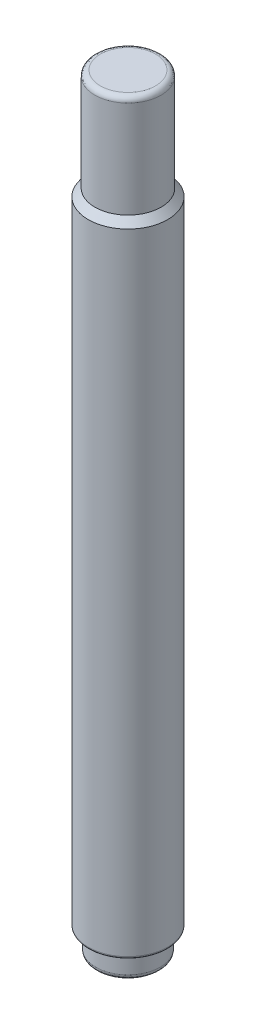
ISO-10303-21;
HEADER;
FILE_DESCRIPTION(('STEP AP214'),'2;1');
FILE_NAME('part.step','',(''),(''),'','','');
FILE_SCHEMA(('AUTOMOTIVE_DESIGN { 1 0 10303 214 1 1 1 1 }'));
ENDSEC;
DATA;
#1=APPLICATION_CONTEXT('core data for automotive mechanical design processes');
#2=APPLICATION_PROTOCOL_DEFINITION('international standard','automotive_design',2000,#1);
#3=PRODUCT_CONTEXT('',#1,'mechanical');
#4=PRODUCT('Part','Part','',(#3));
#5=PRODUCT_RELATED_PRODUCT_CATEGORY('part','',(#4));
#6=PRODUCT_DEFINITION_FORMATION('','',#4);
#7=PRODUCT_DEFINITION_CONTEXT('part definition',#1,'design');
#8=PRODUCT_DEFINITION('design','',#6,#7);
#9=PRODUCT_DEFINITION_SHAPE('','',#8);
#10=(LENGTH_UNIT() NAMED_UNIT(*) SI_UNIT(.MILLI.,.METRE.));
#11=(NAMED_UNIT(*) PLANE_ANGLE_UNIT() SI_UNIT($,.RADIAN.));
#12=(NAMED_UNIT(*) SI_UNIT($,.STERADIAN.) SOLID_ANGLE_UNIT());
#13=UNCERTAINTY_MEASURE_WITH_UNIT(LENGTH_MEASURE(1.E-05),#10,'distance_accuracy_value','');
#14=(GEOMETRIC_REPRESENTATION_CONTEXT(3) GLOBAL_UNCERTAINTY_ASSIGNED_CONTEXT((#13)) GLOBAL_UNIT_ASSIGNED_CONTEXT((#10,
#11,#12)) REPRESENTATION_CONTEXT('',''));
#15=CARTESIAN_POINT('',(0.,0.,0.));
#16=DIRECTION('',(0.,0.,1.));
#17=DIRECTION('',(1.,0.,0.));
#18=AXIS2_PLACEMENT_3D('',#15,#16,#17);
#19=CARTESIAN_POINT('',(0.,72.9725,0.));
#20=DIRECTION('',(0.,1.,0.));
#21=DIRECTION('',(0.,0.,1.));
#22=AXIS2_PLACEMENT_3D('',#19,#20,#21);
#23=CYLINDRICAL_SURFACE('',#22,6.3);
#24=CARTESIAN_POINT('',(0.,71.9625,0.));
#25=DIRECTION('',(0.,-1.,0.));
#26=DIRECTION('',(0.,0.,-1.));
#27=AXIS2_PLACEMENT_3D('',#24,#25,#26);
#28=CIRCLE('',#27,6.3);
#29=CARTESIAN_POINT('',(0.,71.9625,6.3));
#30=VERTEX_POINT('',#29);
#31=EDGE_CURVE('E51',#30,#30,#28,.T.);
#32=CARTESIAN_POINT('',(0.,53.4795,0.));
#33=DIRECTION('',(0.,1.,0.));
#34=DIRECTION('',(0.,0.,1.));
#35=AXIS2_PLACEMENT_3D('',#32,#33,#34);
#36=CIRCLE('',#35,6.3);
#37=CARTESIAN_POINT('',(0.,53.4795,6.3));
#38=VERTEX_POINT('',#37);
#39=EDGE_CURVE('E69',#38,#38,#36,.T.);
#40=CARTESIAN_POINT('',(0.,71.9625,6.3));
#41=CARTESIAN_POINT('',(0.,71.76996875,6.3));
#42=CARTESIAN_POINT('',(0.,71.5774375,6.3));
#43=CARTESIAN_POINT('',(0.,71.192375,6.3));
#44=CARTESIAN_POINT('',(0.,70.99984375,6.3));
#45=CARTESIAN_POINT('',(0.,70.61478125,6.3));
#46=CARTESIAN_POINT('',(0.,70.42225,6.3));
#47=CARTESIAN_POINT('',(0.,70.0371875,6.3));
#48=CARTESIAN_POINT('',(0.,69.84465625,6.3));
#49=CARTESIAN_POINT('',(0.,69.45959375,6.3));
#50=CARTESIAN_POINT('',(0.,69.2670625,6.3));
#51=CARTESIAN_POINT('',(0.,68.882,6.3));
#52=CARTESIAN_POINT('',(0.,68.68946875,6.3));
#53=CARTESIAN_POINT('',(0.,68.30440625,6.3));
#54=CARTESIAN_POINT('',(0.,68.111875,6.3));
#55=CARTESIAN_POINT('',(0.,67.7268125,6.3));
#56=CARTESIAN_POINT('',(0.,67.53428125,6.3));
#57=CARTESIAN_POINT('',(0.,67.14921875,6.3));
#58=CARTESIAN_POINT('',(0.,66.9566875,6.3));
#59=CARTESIAN_POINT('',(0.,66.571625,6.3));
#60=CARTESIAN_POINT('',(0.,66.37909375,6.3));
#61=CARTESIAN_POINT('',(0.,65.99403125,6.3));
#62=CARTESIAN_POINT('',(0.,65.8015,6.3));
#63=CARTESIAN_POINT('',(0.,65.4164375,6.3));
#64=CARTESIAN_POINT('',(0.,65.22390625,6.3));
#65=CARTESIAN_POINT('',(0.,64.83884375,6.3));
#66=CARTESIAN_POINT('',(0.,64.6463125,6.3));
#67=CARTESIAN_POINT('',(0.,64.26125,6.3));
#68=CARTESIAN_POINT('',(0.,64.06871875,6.3));
#69=CARTESIAN_POINT('',(0.,63.68365625,6.3));
#70=CARTESIAN_POINT('',(0.,63.491125,6.3));
#71=CARTESIAN_POINT('',(0.,63.1060625,6.3));
#72=CARTESIAN_POINT('',(0.,62.91353125,6.3));
#73=CARTESIAN_POINT('',(0.,62.52846875,6.3));
#74=CARTESIAN_POINT('',(0.,62.3359375,6.3));
#75=CARTESIAN_POINT('',(0.,61.950875,6.3));
#76=CARTESIAN_POINT('',(0.,61.75834375,6.3));
#77=CARTESIAN_POINT('',(0.,61.37328125,6.3));
#78=CARTESIAN_POINT('',(0.,61.18075,6.3));
#79=CARTESIAN_POINT('',(0.,60.7956875,6.3));
#80=CARTESIAN_POINT('',(0.,60.60315625,6.3));
#81=CARTESIAN_POINT('',(0.,60.21809375,6.3));
#82=CARTESIAN_POINT('',(0.,60.0255625,6.3));
#83=CARTESIAN_POINT('',(0.,59.6405,6.3));
#84=CARTESIAN_POINT('',(0.,59.44796875,6.3));
#85=CARTESIAN_POINT('',(0.,59.06290625,6.3));
#86=CARTESIAN_POINT('',(0.,58.870375,6.3));
#87=CARTESIAN_POINT('',(0.,58.4853125,6.3));
#88=CARTESIAN_POINT('',(0.,58.29278125,6.3));
#89=CARTESIAN_POINT('',(0.,57.90771875,6.3));
#90=CARTESIAN_POINT('',(0.,57.7151875,6.3));
#91=CARTESIAN_POINT('',(0.,57.330125,6.3));
#92=CARTESIAN_POINT('',(0.,57.13759375,6.3));
#93=CARTESIAN_POINT('',(0.,56.75253125,6.3));
#94=CARTESIAN_POINT('',(0.,56.56,6.3));
#95=CARTESIAN_POINT('',(0.,56.1749375,6.3));
#96=CARTESIAN_POINT('',(0.,55.98240625,6.3));
#97=CARTESIAN_POINT('',(0.,55.59734375,6.3));
#98=CARTESIAN_POINT('',(0.,55.4048125,6.3));
#99=CARTESIAN_POINT('',(0.,55.01975,6.3));
#100=CARTESIAN_POINT('',(0.,54.82721875,6.3));
#101=CARTESIAN_POINT('',(0.,54.44215625,6.3));
#102=CARTESIAN_POINT('',(0.,54.249625,6.3));
#103=CARTESIAN_POINT('',(0.,53.8645625,6.3));
#104=CARTESIAN_POINT('',(0.,53.67203125,6.3));
#105=CARTESIAN_POINT('',(0.,53.4795,6.3));
#106=B_SPLINE_CURVE_WITH_KNOTS('',3,(#40,#41,#42,#43,#44,#45,#46,#47,#48,#49,#50,#51,#52,#53,
#54,#55,#56,#57,#58,#59,#60,#61,#62,#63,#64,#65,#66,#67,#68,#69,#70,#71,#72,#73,#74,#75,#76,#77,
#78,#79,#80,#81,#82,#83,#84,#85,#86,#87,#88,#89,#90,#91,#92,#93,#94,#95,#96,#97,#98,#99,#100,
#101,#102,#103,#104,#105),.UNSPECIFIED.,.F.,.F.,(4,2,2,2,2,2,2,2,2,2,2,2,2,2,2,2,2,2,2,2,2,2,2,
2,2,2,2,2,2,2,2,2,4),(0.,0.577593749999994,1.15518749999999,1.73278125,2.31037499999999,
2.88796875,3.46556249999999,4.04315625,4.62074999999999,5.19834375,5.77593749999999,6.35353125,
6.931125,7.50871874999999,8.0863125,8.66390624999999,9.2415,9.81909375,10.3966875,10.97428125,
11.551875,12.12946875,12.7070625,13.28465625,13.86225,14.43984375,15.0174375,15.59503125,
16.172625,16.75021875,17.3278125,17.90540625,18.483),.UNSPECIFIED.);
#107=EDGE_CURVE('BSEAM37',#30,#38,#106,.T.);
#108=ORIENTED_EDGE('',*,*,#31,.T.);
#109=ORIENTED_EDGE('',*,*,#39,.T.);
#110=ORIENTED_EDGE('',*,*,#107,.T.);
#111=ORIENTED_EDGE('',*,*,#107,.F.);
#112=EDGE_LOOP('',(#108,#110,#109,#111));
#113=FACE_BOUND('',#112,.T.);
#114=ADVANCED_FACE('F37',(#113),#23,.T.);
#115=CARTESIAN_POINT('',(6.29999999999997,72.9725,0.));
#116=DIRECTION('',(0.,-1.,0.));
#117=DIRECTION('',(1.,0.,0.));
#118=AXIS2_PLACEMENT_3D('',#115,#116,#117);
#119=PLANE('',#118);
#120=CARTESIAN_POINT('',(0.,72.9725,0.));
#121=DIRECTION('',(0.,1.,0.));
#122=DIRECTION('',(0.,0.,1.));
#123=AXIS2_PLACEMENT_3D('',#120,#121,#122);
#124=CIRCLE('',#123,5.25);
#125=CARTESIAN_POINT('',(0.,72.9725,5.25));
#126=VERTEX_POINT('',#125);
#127=EDGE_CURVE('E43',#126,#126,#124,.T.);
#128=ORIENTED_EDGE('',*,*,#127,.T.);
#129=EDGE_LOOP('',(#128));
#130=FACE_BOUND('',#129,.T.);
#131=ADVANCED_FACE('F78',(#130),#119,.F.);
#132=CARTESIAN_POINT('',(0.,-72.9725,0.));
#133=DIRECTION('',(0.,1.,0.));
#134=DIRECTION('',(-1.,0.,0.));
#135=AXIS2_PLACEMENT_3D('',#132,#133,#134);
#136=PLANE('',#135);
#137=CARTESIAN_POINT('',(0.,-72.9725,0.));
#138=DIRECTION('',(0.,-1.,0.));
#139=DIRECTION('',(0.,0.,-1.));
#140=AXIS2_PLACEMENT_3D('',#137,#138,#139);
#141=CIRCLE('',#140,5.0925);
#142=CARTESIAN_POINT('',(0.,-72.9725,-5.0925));
#143=VERTEX_POINT('',#142);
#144=EDGE_CURVE('E10',#143,#143,#141,.T.);
#145=ORIENTED_EDGE('',*,*,#144,.T.);
#146=EDGE_LOOP('',(#145));
#147=FACE_BOUND('',#146,.T.);
#148=ADVANCED_FACE('F99',(#147),#136,.F.);
#149=CARTESIAN_POINT('',(0.,72.9725,0.));
#150=DIRECTION('',(0.,1.,0.));
#151=DIRECTION('',(0.,0.,1.));
#152=AXIS2_PLACEMENT_3D('',#149,#150,#151);
#153=CYLINDRICAL_SURFACE('',#152,6.1425);
#154=CARTESIAN_POINT('',(0.,-71.9625,0.));
#155=DIRECTION('',(0.,1.,0.));
#156=DIRECTION('',(0.,0.,1.));
#157=AXIS2_PLACEMENT_3D('',#154,#155,#156);
#158=CIRCLE('',#157,6.1425);
#159=CARTESIAN_POINT('',(0.,-71.9625,6.1425));
#160=VERTEX_POINT('',#159);
#161=EDGE_CURVE('E47',#160,#160,#158,.T.);
#162=ORIENTED_EDGE('',*,*,#161,.T.);
#163=EDGE_LOOP('',(#162));
#164=FACE_BOUND('',#163,.T.);
#165=CARTESIAN_POINT('',(0.,-68.90725,0.));
#166=DIRECTION('',(0.,-1.,0.));
#167=DIRECTION('',(0.,0.,-1.));
#168=AXIS2_PLACEMENT_3D('',#165,#166,#167);
#169=CIRCLE('',#168,6.1425);
#170=CARTESIAN_POINT('',(0.,-68.90725,-6.1425));
#171=VERTEX_POINT('',#170);
#172=EDGE_CURVE('E54',#171,#171,#169,.T.);
#173=ORIENTED_EDGE('',*,*,#172,.T.);
#174=EDGE_LOOP('',(#173));
#175=FACE_BOUND('',#174,.T.);
#176=ADVANCED_FACE('F105',(#164,#175),#153,.T.);
#177=CARTESIAN_POINT('',(6.14250000000002,-68.4275,0.));
#178=DIRECTION('',(0.,1.,0.));
#179=DIRECTION('',(-1.,0.,0.));
#180=AXIS2_PLACEMENT_3D('',#177,#178,#179);
#181=PLANE('',#180);
#182=CARTESIAN_POINT('',(0.,-68.4275,0.));
#183=DIRECTION('',(0.,1.,0.));
#184=DIRECTION('',(0.,0.,1.));
#185=AXIS2_PLACEMENT_3D('',#182,#183,#184);
#186=CIRCLE('',#185,6.64125);
#187=CARTESIAN_POINT('',(0.,-68.4275,6.64125));
#188=VERTEX_POINT('',#187);
#189=EDGE_CURVE('E58',#188,#188,#186,.T.);
#190=ORIENTED_EDGE('',*,*,#189,.T.);
#191=EDGE_LOOP('',(#190));
#192=FACE_BOUND('',#191,.T.);
#193=CARTESIAN_POINT('',(0.,-68.4275,0.));
#194=DIRECTION('',(0.,-1.,0.));
#195=DIRECTION('',(0.,0.,-1.));
#196=AXIS2_PLACEMENT_3D('',#193,#194,#195);
#197=CIRCLE('',#196,7.06125000000002);
#198=CARTESIAN_POINT('',(0.,-68.4275,-7.06125000000002));
#199=VERTEX_POINT('',#198);
#200=EDGE_CURVE('E61',#199,#199,#197,.T.);
#201=ORIENTED_EDGE('',*,*,#200,.T.);
#202=EDGE_LOOP('',(#201));
#203=FACE_BOUND('',#202,.T.);
#204=ADVANCED_FACE('F108',(#192,#203),#181,.F.);
#205=CARTESIAN_POINT('',(0.,72.9725,0.));
#206=DIRECTION('',(0.,1.,0.));
#207=DIRECTION('',(0.,0.,1.));
#208=AXIS2_PLACEMENT_3D('',#205,#206,#207);
#209=CYLINDRICAL_SURFACE('',#208,7.56000000000002);
#210=CARTESIAN_POINT('',(0.,-67.94775,0.));
#211=DIRECTION('',(0.,1.,0.));
#212=DIRECTION('',(0.,0.,1.));
#213=AXIS2_PLACEMENT_3D('',#210,#211,#212);
#214=CIRCLE('',#213,7.56000000000002);
#215=CARTESIAN_POINT('',(0.,-67.94775,7.56000000000002));
#216=VERTEX_POINT('',#215);
#217=EDGE_CURVE('E57',#216,#216,#214,.T.);
#218=ORIENTED_EDGE('',*,*,#217,.T.);
#219=EDGE_LOOP('',(#218));
#220=FACE_BOUND('',#219,.T.);
#221=CARTESIAN_POINT('',(0.,52.0655,0.));
#222=DIRECTION('',(0.,1.,0.));
#223=DIRECTION('',(0.,0.,1.));
#224=AXIS2_PLACEMENT_3D('',#221,#222,#223);
#225=CIRCLE('',#224,7.56000000000004);
#226=CARTESIAN_POINT('',(0.,52.0655,7.56000000000004));
#227=VERTEX_POINT('',#226);
#228=EDGE_CURVE('E64',#227,#227,#225,.T.);
#229=ORIENTED_EDGE('',*,*,#228,.F.);
#230=EDGE_LOOP('',(#229));
#231=FACE_BOUND('',#230,.T.);
#232=ADVANCED_FACE('F112',(#220,#231),#209,.T.);
#233=CARTESIAN_POINT('',(0.,52.0655,0.));
#234=DIRECTION('',(0.,-1.,0.));
#235=DIRECTION('',(0.,0.,-1.));
#236=AXIS2_PLACEMENT_3D('',#233,#234,#235);
#237=CONICAL_SURFACE('',#236,7.56000000000004,0.727870087148958);
#238=ORIENTED_EDGE('',*,*,#39,.F.);
#239=EDGE_LOOP('',(#238));
#240=FACE_BOUND('',#239,.T.);
#241=ORIENTED_EDGE('',*,*,#228,.T.);
#242=EDGE_LOOP('',(#241));
#243=FACE_BOUND('',#242,.T.);
#244=ADVANCED_FACE('F116',(#240,#243),#237,.T.);
#245=CARTESIAN_POINT('',(-6.14249999999998,-68.90725,0.));
#246=CARTESIAN_POINT('',(-6.14249999999998,-68.90725,12.285));
#247=CARTESIAN_POINT('',(6.14250000000002,-68.90725,12.285));
#248=CARTESIAN_POINT('',(6.14250000000002,-68.90725,0.));
#249=CARTESIAN_POINT('',(6.14250000000002,-68.90725,-12.285));
#250=CARTESIAN_POINT('',(-6.14249999999998,-68.90725,-12.285));
#251=CARTESIAN_POINT('',(-6.14249999999998,-68.90725,0.));
#252=CARTESIAN_POINT('',(-6.14249999999998,-67.94775,0.));
#253=CARTESIAN_POINT('',(-6.14249999999998,-67.94775,12.285));
#254=CARTESIAN_POINT('',(6.14250000000002,-67.94775,12.285));
#255=CARTESIAN_POINT('',(6.14250000000002,-67.94775,0.));
#256=CARTESIAN_POINT('',(6.14250000000002,-67.94775,-12.285));
#257=CARTESIAN_POINT('',(-6.14249999999998,-67.94775,-12.285));
#258=CARTESIAN_POINT('',(-6.14249999999998,-67.94775,0.));
#259=CARTESIAN_POINT('',(-7.13999999999998,-67.94775,0.));
#260=CARTESIAN_POINT('',(-7.13999999999998,-67.94775,14.28));
#261=CARTESIAN_POINT('',(7.14000000000002,-67.94775,14.28));
#262=CARTESIAN_POINT('',(7.14000000000002,-67.94775,0.));
#263=CARTESIAN_POINT('',(7.14000000000002,-67.94775,-14.28));
#264=CARTESIAN_POINT('',(-7.13999999999998,-67.94775,-14.28));
#265=CARTESIAN_POINT('',(-7.13999999999998,-67.94775,0.));
#266=CARTESIAN_POINT('',(-7.13999999999998,-68.90725,0.));
#267=CARTESIAN_POINT('',(-7.13999999999998,-68.90725,14.28));
#268=CARTESIAN_POINT('',(7.14000000000002,-68.90725,14.28));
#269=CARTESIAN_POINT('',(7.14000000000002,-68.90725,0.));
#270=CARTESIAN_POINT('',(7.14000000000002,-68.90725,-14.28));
#271=CARTESIAN_POINT('',(-7.13999999999998,-68.90725,-14.28));
#272=CARTESIAN_POINT('',(-7.13999999999998,-68.90725,0.));
#273=CARTESIAN_POINT('',(-7.13999999999998,-69.86675,0.));
#274=CARTESIAN_POINT('',(-7.13999999999998,-69.86675,14.28));
#275=CARTESIAN_POINT('',(7.14000000000002,-69.86675,14.28));
#276=CARTESIAN_POINT('',(7.14000000000002,-69.86675,0.));
#277=CARTESIAN_POINT('',(7.14000000000002,-69.86675,-14.28));
#278=CARTESIAN_POINT('',(-7.13999999999998,-69.86675,-14.28));
#279=CARTESIAN_POINT('',(-7.13999999999998,-69.86675,0.));
#280=CARTESIAN_POINT('',(-6.14249999999998,-69.86675,0.));
#281=CARTESIAN_POINT('',(-6.14249999999998,-69.86675,12.285));
#282=CARTESIAN_POINT('',(6.14250000000002,-69.86675,12.285));
#283=CARTESIAN_POINT('',(6.14250000000002,-69.86675,0.));
#284=CARTESIAN_POINT('',(6.14250000000002,-69.86675,-12.285));
#285=CARTESIAN_POINT('',(-6.14249999999998,-69.86675,-12.285));
#286=CARTESIAN_POINT('',(-6.14249999999998,-69.86675,0.));
#287=CARTESIAN_POINT('',(-6.14249999999998,-68.90725,0.));
#288=CARTESIAN_POINT('',(-6.14249999999998,-68.90725,12.285));
#289=CARTESIAN_POINT('',(6.14250000000002,-68.90725,12.285));
#290=CARTESIAN_POINT('',(6.14250000000002,-68.90725,0.));
#291=CARTESIAN_POINT('',(6.14250000000002,-68.90725,-12.285));
#292=CARTESIAN_POINT('',(-6.14249999999998,-68.90725,-12.285));
#293=CARTESIAN_POINT('',(-6.14249999999998,-68.90725,0.));
#294=(BOUNDED_SURFACE() B_SPLINE_SURFACE(3,3,((#245,#246,#247,#248,#249,#250,#251),(#252,#253,
#254,#255,#256,#257,#258),(#259,#260,#261,#262,#263,#264,#265),(#266,#267,#268,#269,#270,#271,
#272),(#273,#274,#275,#276,#277,#278,#279),(#280,#281,#282,#283,#284,#285,#286),(#287,#288,#289,
#290,#291,#292,#293)),.UNSPECIFIED.,.T.,.T.,.F.) B_SPLINE_SURFACE_WITH_KNOTS((4,3,4),(4,3,4),
(0.,0.5,1.),(0.,0.5,1.),
.UNSPECIFIED.) GEOMETRIC_REPRESENTATION_ITEM() RATIONAL_B_SPLINE_SURFACE(((1.,0.333333333333333,
0.333333333333333,1.,0.333333333333333,0.333333333333333,1.),(0.333333333333333,
0.111111111111111,0.111111111111111,0.333333333333333,0.111111111111111,0.111111111111111,
0.333333333333333),(0.333333333333333,0.111111111111111,0.111111111111111,0.333333333333333,
0.111111111111111,0.111111111111111,0.333333333333333),(1.,0.333333333333333,0.333333333333333,
1.,0.333333333333333,0.333333333333333,1.),(0.333333333333333,0.111111111111111,
0.111111111111111,0.333333333333333,0.111111111111111,0.111111111111111,0.333333333333333),
(0.333333333333333,0.111111111111111,0.111111111111111,0.333333333333333,0.111111111111111,
0.111111111111111,0.333333333333333),(1.,0.333333333333333,0.333333333333333,1.,
0.333333333333333,0.333333333333333,1.))) REPRESENTATION_ITEM('') SURFACE());
#295=ORIENTED_EDGE('',*,*,#172,.F.);
#296=EDGE_LOOP('',(#295));
#297=FACE_BOUND('',#296,.T.);
#298=ORIENTED_EDGE('',*,*,#189,.F.);
#299=EDGE_LOOP('',(#298));
#300=FACE_BOUND('',#299,.T.);
#301=ADVANCED_FACE('F89',(#297,#300),#294,.F.);
#302=CARTESIAN_POINT('',(-6.56250000000001,-67.94775,0.));
#303=CARTESIAN_POINT('',(-6.56250000000001,-67.94775,13.125));
#304=CARTESIAN_POINT('',(6.56250000000004,-67.94775,13.125));
#305=CARTESIAN_POINT('',(6.56250000000004,-67.94775,0.));
#306=CARTESIAN_POINT('',(6.56250000000004,-67.94775,-13.125));
#307=CARTESIAN_POINT('',(-6.56250000000001,-67.94775,-13.125));
#308=CARTESIAN_POINT('',(-6.56250000000001,-67.94775,0.));
#309=CARTESIAN_POINT('',(-6.56250000000001,-66.98825,0.));
#310=CARTESIAN_POINT('',(-6.56250000000001,-66.98825,13.125));
#311=CARTESIAN_POINT('',(6.56250000000004,-66.98825,13.125));
#312=CARTESIAN_POINT('',(6.56250000000004,-66.98825,0.));
#313=CARTESIAN_POINT('',(6.56250000000004,-66.98825,-13.125));
#314=CARTESIAN_POINT('',(-6.56250000000001,-66.98825,-13.125));
#315=CARTESIAN_POINT('',(-6.56250000000001,-66.98825,0.));
#316=CARTESIAN_POINT('',(-7.56000000000001,-66.98825,0.));
#317=CARTESIAN_POINT('',(-7.56000000000001,-66.98825,15.12));
#318=CARTESIAN_POINT('',(7.56000000000004,-66.98825,15.12));
#319=CARTESIAN_POINT('',(7.56000000000004,-66.98825,0.));
#320=CARTESIAN_POINT('',(7.56000000000004,-66.98825,-15.12));
#321=CARTESIAN_POINT('',(-7.56000000000001,-66.98825,-15.12));
#322=CARTESIAN_POINT('',(-7.56000000000001,-66.98825,0.));
#323=CARTESIAN_POINT('',(-7.56000000000001,-67.94775,0.));
#324=CARTESIAN_POINT('',(-7.56000000000001,-67.94775,15.12));
#325=CARTESIAN_POINT('',(7.56000000000004,-67.94775,15.12));
#326=CARTESIAN_POINT('',(7.56000000000004,-67.94775,0.));
#327=CARTESIAN_POINT('',(7.56000000000004,-67.94775,-15.12));
#328=CARTESIAN_POINT('',(-7.56000000000001,-67.94775,-15.12));
#329=CARTESIAN_POINT('',(-7.56000000000001,-67.94775,0.));
#330=CARTESIAN_POINT('',(-7.56000000000001,-68.90725,0.));
#331=CARTESIAN_POINT('',(-7.56000000000001,-68.90725,15.12));
#332=CARTESIAN_POINT('',(7.56000000000004,-68.90725,15.12));
#333=CARTESIAN_POINT('',(7.56000000000004,-68.90725,0.));
#334=CARTESIAN_POINT('',(7.56000000000004,-68.90725,-15.12));
#335=CARTESIAN_POINT('',(-7.56000000000001,-68.90725,-15.12));
#336=CARTESIAN_POINT('',(-7.56000000000001,-68.90725,0.));
#337=CARTESIAN_POINT('',(-6.56250000000001,-68.90725,0.));
#338=CARTESIAN_POINT('',(-6.56250000000001,-68.90725,13.125));
#339=CARTESIAN_POINT('',(6.56250000000004,-68.90725,13.125));
#340=CARTESIAN_POINT('',(6.56250000000004,-68.90725,0.));
#341=CARTESIAN_POINT('',(6.56250000000004,-68.90725,-13.125));
#342=CARTESIAN_POINT('',(-6.56250000000001,-68.90725,-13.125));
#343=CARTESIAN_POINT('',(-6.56250000000001,-68.90725,0.));
#344=CARTESIAN_POINT('',(-6.56250000000001,-67.94775,0.));
#345=CARTESIAN_POINT('',(-6.56250000000001,-67.94775,13.125));
#346=CARTESIAN_POINT('',(6.56250000000004,-67.94775,13.125));
#347=CARTESIAN_POINT('',(6.56250000000004,-67.94775,0.));
#348=CARTESIAN_POINT('',(6.56250000000004,-67.94775,-13.125));
#349=CARTESIAN_POINT('',(-6.56250000000001,-67.94775,-13.125));
#350=CARTESIAN_POINT('',(-6.56250000000001,-67.94775,0.));
#351=(BOUNDED_SURFACE() B_SPLINE_SURFACE(3,3,((#302,#303,#304,#305,#306,#307,#308),(#309,#310,
#311,#312,#313,#314,#315),(#316,#317,#318,#319,#320,#321,#322),(#323,#324,#325,#326,#327,#328,
#329),(#330,#331,#332,#333,#334,#335,#336),(#337,#338,#339,#340,#341,#342,#343),(#344,#345,#346,
#347,#348,#349,#350)),.UNSPECIFIED.,.T.,.T.,.F.) B_SPLINE_SURFACE_WITH_KNOTS((4,3,4),(4,3,4),
(0.,0.5,1.),(0.,0.5,1.),
.UNSPECIFIED.) GEOMETRIC_REPRESENTATION_ITEM() RATIONAL_B_SPLINE_SURFACE(((1.,0.333333333333333,
0.333333333333333,1.,0.333333333333333,0.333333333333333,1.),(0.333333333333333,
0.111111111111111,0.111111111111111,0.333333333333333,0.111111111111111,0.111111111111111,
0.333333333333333),(0.333333333333333,0.111111111111111,0.111111111111111,0.333333333333333,
0.111111111111111,0.111111111111111,0.333333333333333),(1.,0.333333333333333,0.333333333333333,
1.,0.333333333333333,0.333333333333333,1.),(0.333333333333333,0.111111111111111,
0.111111111111111,0.333333333333333,0.111111111111111,0.111111111111111,0.333333333333333),
(0.333333333333333,0.111111111111111,0.111111111111111,0.333333333333333,0.111111111111111,
0.111111111111111,0.333333333333333),(1.,0.333333333333333,0.333333333333333,1.,
0.333333333333333,0.333333333333333,1.))) REPRESENTATION_ITEM('') SURFACE());
#352=ORIENTED_EDGE('',*,*,#200,.F.);
#353=EDGE_LOOP('',(#352));
#354=FACE_BOUND('',#353,.T.);
#355=ORIENTED_EDGE('',*,*,#217,.F.);
#356=EDGE_LOOP('',(#355));
#357=FACE_BOUND('',#356,.T.);
#358=ADVANCED_FACE('F82',(#354,#357),#351,.T.);
#359=CARTESIAN_POINT('',(4.19999999999997,71.9625,0.));
#360=CARTESIAN_POINT('',(4.19999999999997,71.9625,8.4));
#361=CARTESIAN_POINT('',(-4.20000000000003,71.9625,8.4));
#362=CARTESIAN_POINT('',(-4.20000000000003,71.9625,0.));
#363=CARTESIAN_POINT('',(-4.20000000000003,71.9625,-8.4));
#364=CARTESIAN_POINT('',(4.19999999999997,71.9625,-8.4));
#365=CARTESIAN_POINT('',(4.19999999999997,71.9625,0.));
#366=CARTESIAN_POINT('',(4.19999999999997,69.9425,0.));
#367=CARTESIAN_POINT('',(4.19999999999997,69.9425,8.4));
#368=CARTESIAN_POINT('',(-4.20000000000003,69.9425,8.4));
#369=CARTESIAN_POINT('',(-4.20000000000003,69.9425,0.));
#370=CARTESIAN_POINT('',(-4.20000000000003,69.9425,-8.4));
#371=CARTESIAN_POINT('',(4.19999999999997,69.9425,-8.4));
#372=CARTESIAN_POINT('',(4.19999999999997,69.9425,0.));
#373=CARTESIAN_POINT('',(6.29999999999997,69.9425,0.));
#374=CARTESIAN_POINT('',(6.29999999999997,69.9425,12.6));
#375=CARTESIAN_POINT('',(-6.30000000000003,69.9425,12.6));
#376=CARTESIAN_POINT('',(-6.30000000000003,69.9425,0.));
#377=CARTESIAN_POINT('',(-6.30000000000003,69.9425,-12.6));
#378=CARTESIAN_POINT('',(6.29999999999997,69.9425,-12.6));
#379=CARTESIAN_POINT('',(6.29999999999997,69.9425,0.));
#380=CARTESIAN_POINT('',(6.29999999999997,71.9625,0.));
#381=CARTESIAN_POINT('',(6.29999999999997,71.9625,12.6));
#382=CARTESIAN_POINT('',(-6.30000000000003,71.9625,12.6));
#383=CARTESIAN_POINT('',(-6.30000000000003,71.9625,0.));
#384=CARTESIAN_POINT('',(-6.30000000000003,71.9625,-12.6));
#385=CARTESIAN_POINT('',(6.29999999999997,71.9625,-12.6));
#386=CARTESIAN_POINT('',(6.29999999999997,71.9625,0.));
#387=CARTESIAN_POINT('',(6.29999999999997,73.9825,0.));
#388=CARTESIAN_POINT('',(6.29999999999997,73.9825,12.6));
#389=CARTESIAN_POINT('',(-6.30000000000003,73.9825,12.6));
#390=CARTESIAN_POINT('',(-6.30000000000003,73.9825,0.));
#391=CARTESIAN_POINT('',(-6.30000000000003,73.9825,-12.6));
#392=CARTESIAN_POINT('',(6.29999999999997,73.9825,-12.6));
#393=CARTESIAN_POINT('',(6.29999999999997,73.9825,0.));
#394=CARTESIAN_POINT('',(4.19999999999997,73.9825,0.));
#395=CARTESIAN_POINT('',(4.19999999999997,73.9825,8.4));
#396=CARTESIAN_POINT('',(-4.20000000000003,73.9825,8.4));
#397=CARTESIAN_POINT('',(-4.20000000000003,73.9825,0.));
#398=CARTESIAN_POINT('',(-4.20000000000003,73.9825,-8.4));
#399=CARTESIAN_POINT('',(4.19999999999997,73.9825,-8.4));
#400=CARTESIAN_POINT('',(4.19999999999997,73.9825,0.));
#401=CARTESIAN_POINT('',(4.19999999999997,71.9625,0.));
#402=CARTESIAN_POINT('',(4.19999999999997,71.9625,8.4));
#403=CARTESIAN_POINT('',(-4.20000000000003,71.9625,8.4));
#404=CARTESIAN_POINT('',(-4.20000000000003,71.9625,0.));
#405=CARTESIAN_POINT('',(-4.20000000000003,71.9625,-8.4));
#406=CARTESIAN_POINT('',(4.19999999999997,71.9625,-8.4));
#407=CARTESIAN_POINT('',(4.19999999999997,71.9625,0.));
#408=(BOUNDED_SURFACE() B_SPLINE_SURFACE(3,3,((#359,#360,#361,#362,#363,#364,#365),(#366,#367,
#368,#369,#370,#371,#372),(#373,#374,#375,#376,#377,#378,#379),(#380,#381,#382,#383,#384,#385,
#386),(#387,#388,#389,#390,#391,#392,#393),(#394,#395,#396,#397,#398,#399,#400),(#401,#402,#403,
#404,#405,#406,#407)),.UNSPECIFIED.,.T.,.T.,.F.) B_SPLINE_SURFACE_WITH_KNOTS((4,3,4),(4,3,4),
(0.,0.5,1.),(0.,0.5,1.),
.UNSPECIFIED.) GEOMETRIC_REPRESENTATION_ITEM() RATIONAL_B_SPLINE_SURFACE(((1.,0.333333333333333,
0.333333333333333,1.,0.333333333333333,0.333333333333333,1.),(0.333333333333333,
0.111111111111111,0.111111111111111,0.333333333333333,0.111111111111111,0.111111111111111,
0.333333333333333),(0.333333333333333,0.111111111111111,0.111111111111111,0.333333333333333,
0.111111111111111,0.111111111111111,0.333333333333333),(1.,0.333333333333333,0.333333333333333,
1.,0.333333333333333,0.333333333333333,1.),(0.333333333333333,0.111111111111111,
0.111111111111111,0.333333333333333,0.111111111111111,0.111111111111111,0.333333333333333),
(0.333333333333333,0.111111111111111,0.111111111111111,0.333333333333333,0.111111111111111,
0.111111111111111,0.333333333333333),(1.,0.333333333333333,0.333333333333333,1.,
0.333333333333333,0.333333333333333,1.))) REPRESENTATION_ITEM('') SURFACE());
#409=ORIENTED_EDGE('',*,*,#31,.F.);
#410=EDGE_LOOP('',(#409));
#411=FACE_BOUND('',#410,.T.);
#412=ORIENTED_EDGE('',*,*,#127,.F.);
#413=EDGE_LOOP('',(#412));
#414=FACE_BOUND('',#413,.T.);
#415=ADVANCED_FACE('F80',(#411,#414),#408,.T.);
#416=CARTESIAN_POINT('',(-4.04249999999998,-71.9625,0.));
#417=CARTESIAN_POINT('',(-4.04249999999998,-71.9625,8.085));
#418=CARTESIAN_POINT('',(4.04250000000002,-71.9625,8.085));
#419=CARTESIAN_POINT('',(4.04250000000002,-71.9625,0.));
#420=CARTESIAN_POINT('',(4.04250000000002,-71.9625,-8.085));
#421=CARTESIAN_POINT('',(-4.04249999999998,-71.9625,-8.085));
#422=CARTESIAN_POINT('',(-4.04249999999998,-71.9625,0.));
#423=CARTESIAN_POINT('',(-4.04249999999998,-69.9425,0.));
#424=CARTESIAN_POINT('',(-4.04249999999998,-69.9425,8.085));
#425=CARTESIAN_POINT('',(4.04250000000002,-69.9425,8.085));
#426=CARTESIAN_POINT('',(4.04250000000002,-69.9425,0.));
#427=CARTESIAN_POINT('',(4.04250000000002,-69.9425,-8.085));
#428=CARTESIAN_POINT('',(-4.04249999999998,-69.9425,-8.085));
#429=CARTESIAN_POINT('',(-4.04249999999998,-69.9425,0.));
#430=CARTESIAN_POINT('',(-6.14249999999998,-69.9425,0.));
#431=CARTESIAN_POINT('',(-6.14249999999998,-69.9425,12.285));
#432=CARTESIAN_POINT('',(6.14250000000002,-69.9425,12.285));
#433=CARTESIAN_POINT('',(6.14250000000002,-69.9425,0.));
#434=CARTESIAN_POINT('',(6.14250000000002,-69.9425,-12.285));
#435=CARTESIAN_POINT('',(-6.14249999999998,-69.9425,-12.285));
#436=CARTESIAN_POINT('',(-6.14249999999998,-69.9425,0.));
#437=CARTESIAN_POINT('',(-6.14249999999998,-71.9625,0.));
#438=CARTESIAN_POINT('',(-6.14249999999998,-71.9625,12.285));
#439=CARTESIAN_POINT('',(6.14250000000002,-71.9625,12.285));
#440=CARTESIAN_POINT('',(6.14250000000002,-71.9625,0.));
#441=CARTESIAN_POINT('',(6.14250000000002,-71.9625,-12.285));
#442=CARTESIAN_POINT('',(-6.14249999999998,-71.9625,-12.285));
#443=CARTESIAN_POINT('',(-6.14249999999998,-71.9625,0.));
#444=CARTESIAN_POINT('',(-6.14249999999998,-73.9825,0.));
#445=CARTESIAN_POINT('',(-6.14249999999998,-73.9825,12.285));
#446=CARTESIAN_POINT('',(6.14250000000002,-73.9825,12.285));
#447=CARTESIAN_POINT('',(6.14250000000002,-73.9825,0.));
#448=CARTESIAN_POINT('',(6.14250000000002,-73.9825,-12.285));
#449=CARTESIAN_POINT('',(-6.14249999999998,-73.9825,-12.285));
#450=CARTESIAN_POINT('',(-6.14249999999998,-73.9825,0.));
#451=CARTESIAN_POINT('',(-4.04249999999998,-73.9825,0.));
#452=CARTESIAN_POINT('',(-4.04249999999998,-73.9825,8.085));
#453=CARTESIAN_POINT('',(4.04250000000002,-73.9825,8.085));
#454=CARTESIAN_POINT('',(4.04250000000002,-73.9825,0.));
#455=CARTESIAN_POINT('',(4.04250000000002,-73.9825,-8.085));
#456=CARTESIAN_POINT('',(-4.04249999999998,-73.9825,-8.085));
#457=CARTESIAN_POINT('',(-4.04249999999998,-73.9825,0.));
#458=CARTESIAN_POINT('',(-4.04249999999998,-71.9625,0.));
#459=CARTESIAN_POINT('',(-4.04249999999998,-71.9625,8.085));
#460=CARTESIAN_POINT('',(4.04250000000002,-71.9625,8.085));
#461=CARTESIAN_POINT('',(4.04250000000002,-71.9625,0.));
#462=CARTESIAN_POINT('',(4.04250000000002,-71.9625,-8.085));
#463=CARTESIAN_POINT('',(-4.04249999999998,-71.9625,-8.085));
#464=CARTESIAN_POINT('',(-4.04249999999998,-71.9625,0.));
#465=(BOUNDED_SURFACE() B_SPLINE_SURFACE(3,3,((#416,#417,#418,#419,#420,#421,#422),(#423,#424,
#425,#426,#427,#428,#429),(#430,#431,#432,#433,#434,#435,#436),(#437,#438,#439,#440,#441,#442,
#443),(#444,#445,#446,#447,#448,#449,#450),(#451,#452,#453,#454,#455,#456,#457),(#458,#459,#460,
#461,#462,#463,#464)),.UNSPECIFIED.,.T.,.T.,.F.) B_SPLINE_SURFACE_WITH_KNOTS((4,3,4),(4,3,4),
(0.,0.5,1.),(0.,0.5,1.),
.UNSPECIFIED.) GEOMETRIC_REPRESENTATION_ITEM() RATIONAL_B_SPLINE_SURFACE(((1.,0.333333333333333,
0.333333333333333,1.,0.333333333333333,0.333333333333333,1.),(0.333333333333333,
0.111111111111111,0.111111111111111,0.333333333333333,0.111111111111111,0.111111111111111,
0.333333333333333),(0.333333333333333,0.111111111111111,0.111111111111111,0.333333333333333,
0.111111111111111,0.111111111111111,0.333333333333333),(1.,0.333333333333333,0.333333333333333,
1.,0.333333333333333,0.333333333333333,1.),(0.333333333333333,0.111111111111111,
0.111111111111111,0.333333333333333,0.111111111111111,0.111111111111111,0.333333333333333),
(0.333333333333333,0.111111111111111,0.111111111111111,0.333333333333333,0.111111111111111,
0.111111111111111,0.333333333333333),(1.,0.333333333333333,0.333333333333333,1.,
0.333333333333333,0.333333333333333,1.))) REPRESENTATION_ITEM('') SURFACE());
#466=ORIENTED_EDGE('',*,*,#144,.F.);
#467=EDGE_LOOP('',(#466));
#468=FACE_BOUND('',#467,.T.);
#469=ORIENTED_EDGE('',*,*,#161,.F.);
#470=EDGE_LOOP('',(#469));
#471=FACE_BOUND('',#470,.T.);
#472=ADVANCED_FACE('F39',(#468,#471),#465,.T.);
#473=CLOSED_SHELL('',(#114,#131,#148,#176,#204,#232,#244,#301,#358,#415,#472));
#474=MANIFOLD_SOLID_BREP('B2',#473);
#475=ADVANCED_BREP_SHAPE_REPRESENTATION('',(#18,#474),#14);
#476=SHAPE_DEFINITION_REPRESENTATION(#9,#475);
ENDSEC;
END-ISO-10303-21;
